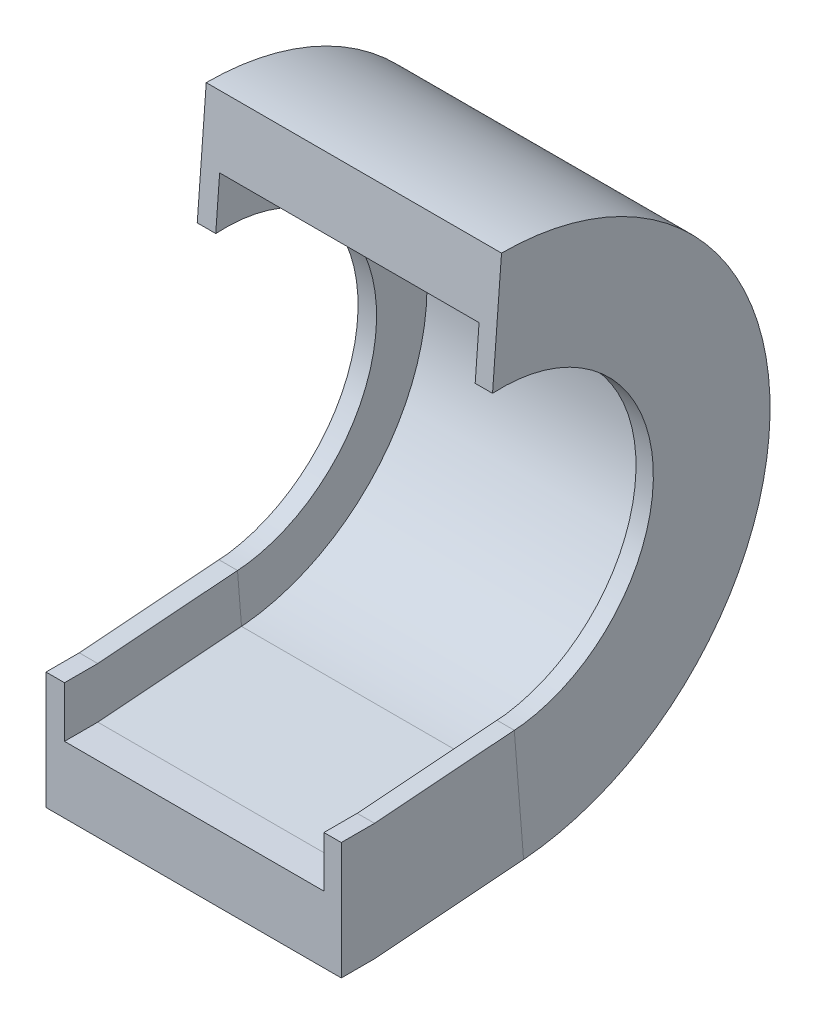
ISO-10303-21;
HEADER;
FILE_DESCRIPTION(('STEP AP214'),'2;1');
FILE_NAME('part.step','',(''),(''),'','','');
FILE_SCHEMA(('AUTOMOTIVE_DESIGN { 1 0 10303 214 1 1 1 1 }'));
ENDSEC;
DATA;
#1=APPLICATION_CONTEXT('core data for automotive mechanical design processes');
#2=APPLICATION_PROTOCOL_DEFINITION('international standard','automotive_design',2000,#1);
#3=PRODUCT_CONTEXT('',#1,'mechanical');
#4=PRODUCT('Part','Part','',(#3));
#5=PRODUCT_RELATED_PRODUCT_CATEGORY('part','',(#4));
#6=PRODUCT_DEFINITION_FORMATION('','',#4);
#7=PRODUCT_DEFINITION_CONTEXT('part definition',#1,'design');
#8=PRODUCT_DEFINITION('design','',#6,#7);
#9=PRODUCT_DEFINITION_SHAPE('','',#8);
#10=(LENGTH_UNIT() NAMED_UNIT(*) SI_UNIT(.MILLI.,.METRE.));
#11=(NAMED_UNIT(*) PLANE_ANGLE_UNIT() SI_UNIT($,.RADIAN.));
#12=(NAMED_UNIT(*) SI_UNIT($,.STERADIAN.) SOLID_ANGLE_UNIT());
#13=UNCERTAINTY_MEASURE_WITH_UNIT(LENGTH_MEASURE(1.E-05),#10,'distance_accuracy_value','');
#14=(GEOMETRIC_REPRESENTATION_CONTEXT(3) GLOBAL_UNCERTAINTY_ASSIGNED_CONTEXT((#13)) GLOBAL_UNIT_ASSIGNED_CONTEXT((#10,
#11,#12)) REPRESENTATION_CONTEXT('',''));
#15=CARTESIAN_POINT('',(0.,0.,0.));
#16=DIRECTION('',(0.,0.,1.));
#17=DIRECTION('',(1.,0.,0.));
#18=AXIS2_PLACEMENT_3D('',#15,#16,#17);
#19=CARTESIAN_POINT('',(0.,10.16,5.08));
#20=DIRECTION('',(0.,1.,0.));
#21=DIRECTION('',(0.,0.,1.));
#22=AXIS2_PLACEMENT_3D('',#19,#20,#21);
#23=PLANE('',#22);
#24=DIRECTION('',(1.,0.,0.));
#25=VECTOR('',#24,1.);
#26=CARTESIAN_POINT('',(0.,10.16,0.));
#27=LINE('',#26,#25);
#28=CARTESIAN_POINT('',(2.82486817631496,10.16,0.));
#29=VERTEX_POINT('',#28);
#30=CARTESIAN_POINT('',(42.4300988688077,10.16,0.));
#31=VERTEX_POINT('',#30);
#32=EDGE_CURVE('E135',#29,#31,#27,.T.);
#33=ORIENTED_EDGE('',*,*,#32,.F.);
#34=DIRECTION('',(0.,0.,-1.));
#35=VECTOR('',#34,1.);
#36=CARTESIAN_POINT('',(2.82486817631496,10.16,5.08));
#37=LINE('',#36,#35);
#38=CARTESIAN_POINT('',(2.82486817631496,10.16,5.08));
#39=VERTEX_POINT('',#38);
#40=EDGE_CURVE('E11',#39,#29,#37,.T.);
#41=ORIENTED_EDGE('',*,*,#40,.F.);
#42=DIRECTION('',(1.,0.,0.));
#43=VECTOR('',#42,1.);
#44=CARTESIAN_POINT('',(0.,10.16,5.08));
#45=LINE('',#44,#43);
#46=CARTESIAN_POINT('',(42.4300988688077,10.16,5.08));
#47=VERTEX_POINT('',#46);
#48=EDGE_CURVE('E145',#39,#47,#45,.T.);
#49=ORIENTED_EDGE('',*,*,#48,.T.);
#50=DIRECTION('',(0.,0.,-1.));
#51=VECTOR('',#50,1.);
#52=CARTESIAN_POINT('',(42.4300988688077,10.16,5.08));
#53=LINE('',#52,#51);
#54=EDGE_CURVE('E53',#47,#31,#53,.T.);
#55=ORIENTED_EDGE('',*,*,#54,.T.);
#56=EDGE_LOOP('',(#33,#41,#49,#55));
#57=FACE_BOUND('',#56,.T.);
#58=ADVANCED_FACE('F37',(#57),#23,.T.);
#59=CARTESIAN_POINT('',(2.82486817631496,0.,5.08));
#60=DIRECTION('',(-1.,0.,0.));
#61=DIRECTION('',(0.,0.,1.));
#62=AXIS2_PLACEMENT_3D('',#59,#60,#61);
#63=PLANE('',#62);
#64=ORIENTED_EDGE('',*,*,#40,.T.);
#65=DIRECTION('',(0.,0.07663842930355,-0.997058950691425));
#66=VECTOR('',#65,1.);
#67=CARTESIAN_POINT('',(2.82486817631496,10.16,0.));
#68=LINE('',#67,#66);
#69=CARTESIAN_POINT('',(2.82486817631496,11.8466468853602,-21.9431216034371));
#70=VERTEX_POINT('',#69);
#71=EDGE_CURVE('E177',#29,#70,#68,.T.);
#72=ORIENTED_EDGE('',*,*,#71,.T.);
#73=DIRECTION('',(0.,0.996845380458141,0.0793680506202854));
#74=VECTOR('',#73,1.);
#75=CARTESIAN_POINT('',(2.82486817631496,19.610093611212,-21.3250020386536));
#76=LINE('',#75,#74);
#77=CARTESIAN_POINT('',(2.82486817631496,19.5517063673251,-21.3296507854093));
#78=VERTEX_POINT('',#77);
#79=EDGE_CURVE('E176',#70,#78,#76,.T.);
#80=ORIENTED_EDGE('',*,*,#79,.T.);
#81=DIRECTION('',(0.,0.07663842930355,-0.997058950691425));
#82=VECTOR('',#81,1.);
#83=CARTESIAN_POINT('',(2.82486817631496,17.9122136044815,0.));
#84=LINE('',#83,#82);
#85=CARTESIAN_POINT('',(2.82486817631496,17.9122136044815,0.));
#86=VERTEX_POINT('',#85);
#87=EDGE_CURVE('E138',#86,#78,#84,.T.);
#88=ORIENTED_EDGE('',*,*,#87,.F.);
#89=DIRECTION('',(0.,0.,-1.));
#90=VECTOR('',#89,1.);
#91=CARTESIAN_POINT('',(2.82486817631496,17.9122136044815,5.08));
#92=LINE('',#91,#90);
#93=CARTESIAN_POINT('',(2.82486817631496,17.9122136044815,5.08));
#94=VERTEX_POINT('',#93);
#95=EDGE_CURVE('E45',#94,#86,#92,.T.);
#96=ORIENTED_EDGE('',*,*,#95,.F.);
#97=DIRECTION('',(0.,1.,0.));
#98=VECTOR('',#97,1.);
#99=CARTESIAN_POINT('',(2.82486817631496,0.,5.08));
#100=LINE('',#99,#98);
#101=EDGE_CURVE('E821',#39,#94,#100,.T.);
#102=ORIENTED_EDGE('',*,*,#101,.F.);
#103=EDGE_LOOP('',(#64,#72,#80,#88,#96,#102));
#104=FACE_BOUND('',#103,.T.);
#105=ADVANCED_FACE('F173',(#104),#63,.F.);
#106=CARTESIAN_POINT('',(0.,17.9122136044815,5.08));
#107=DIRECTION('',(0.,1.,0.));
#108=DIRECTION('',(0.,0.,1.));
#109=AXIS2_PLACEMENT_3D('',#106,#107,#108);
#110=PLANE('',#109);
#111=DIRECTION('',(1.,0.,0.));
#112=VECTOR('',#111,1.);
#113=CARTESIAN_POINT('',(0.,17.9122136044815,0.));
#114=LINE('',#113,#112);
#115=CARTESIAN_POINT('',(0.,17.9122136044815,0.));
#116=VERTEX_POINT('',#115);
#117=EDGE_CURVE('E137',#116,#86,#114,.T.);
#118=ORIENTED_EDGE('',*,*,#117,.F.);
#119=DIRECTION('',(0.,0.,-1.));
#120=VECTOR('',#119,1.);
#121=CARTESIAN_POINT('',(0.,17.9122136044815,5.08));
#122=LINE('',#121,#120);
#123=CARTESIAN_POINT('',(0.,17.9122136044815,5.08));
#124=VERTEX_POINT('',#123);
#125=EDGE_CURVE('E151',#124,#116,#122,.T.);
#126=ORIENTED_EDGE('',*,*,#125,.F.);
#127=DIRECTION('',(1.,0.,0.));
#128=VECTOR('',#127,1.);
#129=CARTESIAN_POINT('',(0.,17.9122136044815,5.08));
#130=LINE('',#129,#128);
#131=EDGE_CURVE('E160',#124,#94,#130,.T.);
#132=ORIENTED_EDGE('',*,*,#131,.T.);
#133=ORIENTED_EDGE('',*,*,#95,.T.);
#134=EDGE_LOOP('',(#118,#126,#132,#133));
#135=FACE_BOUND('',#134,.T.);
#136=ADVANCED_FACE('F157',(#135),#110,.T.);
#137=CARTESIAN_POINT('',(0.,0.,5.08));
#138=DIRECTION('',(-1.,0.,0.));
#139=DIRECTION('',(0.,0.,1.));
#140=AXIS2_PLACEMENT_3D('',#137,#138,#139);
#141=PLANE('',#140);
#142=ORIENTED_EDGE('',*,*,#125,.T.);
#143=DIRECTION('',(0.,0.07663842930355,-0.997058950691425));
#144=VECTOR('',#143,1.);
#145=CARTESIAN_POINT('',(0.,17.9122136044815,0.));
#146=LINE('',#145,#144);
#147=CARTESIAN_POINT('',(0.,19.5517063673251,-21.3296507854093));
#148=VERTEX_POINT('',#147);
#149=EDGE_CURVE('E171',#116,#148,#146,.T.);
#150=ORIENTED_EDGE('',*,*,#149,.T.);
#151=DIRECTION('',(0.,-0.996845380458141,-0.0793680506202854));
#152=VECTOR('',#151,1.);
#153=CARTESIAN_POINT('',(0.,1.81071418925688,-22.7421747262796));
#154=LINE('',#153,#152);
#155=CARTESIAN_POINT('',(0.,1.74844676720198,-22.7471324097905));
#156=VERTEX_POINT('',#155);
#157=EDGE_CURVE('E218',#148,#156,#154,.T.);
#158=ORIENTED_EDGE('',*,*,#157,.T.);
#159=DIRECTION('',(0.,0.07663842930355,-0.997058950691425));
#160=VECTOR('',#159,1.);
#161=CARTESIAN_POINT('',(0.,0.,0.));
#162=LINE('',#161,#160);
#163=CARTESIAN_POINT('',(0.,0.,0.));
#164=VERTEX_POINT('',#163);
#165=EDGE_CURVE('E228',#164,#156,#162,.T.);
#166=ORIENTED_EDGE('',*,*,#165,.F.);
#167=DIRECTION('',(0.,0.,-1.));
#168=VECTOR('',#167,1.);
#169=CARTESIAN_POINT('',(0.,0.,5.08));
#170=LINE('',#169,#168);
#171=CARTESIAN_POINT('',(0.,0.,5.08));
#172=VERTEX_POINT('',#171);
#173=EDGE_CURVE('E149',#172,#164,#170,.T.);
#174=ORIENTED_EDGE('',*,*,#173,.F.);
#175=DIRECTION('',(0.,1.,0.));
#176=VECTOR('',#175,1.);
#177=CARTESIAN_POINT('',(0.,0.,5.08));
#178=LINE('',#177,#176);
#179=EDGE_CURVE('E819',#172,#124,#178,.T.);
#180=ORIENTED_EDGE('',*,*,#179,.T.);
#181=EDGE_LOOP('',(#142,#150,#158,#166,#174,#180));
#182=FACE_BOUND('',#181,.T.);
#183=ADVANCED_FACE('F485',(#182),#141,.T.);
#184=CARTESIAN_POINT('',(0.,0.,5.08));
#185=DIRECTION('',(0.,1.,0.));
#186=DIRECTION('',(0.,0.,1.));
#187=AXIS2_PLACEMENT_3D('',#184,#185,#186);
#188=PLANE('',#187);
#189=DIRECTION('',(1.,0.,0.));
#190=VECTOR('',#189,1.);
#191=CARTESIAN_POINT('',(0.,0.,0.));
#192=LINE('',#191,#190);
#193=CARTESIAN_POINT('',(45.08000001,0.,0.));
#194=VERTEX_POINT('',#193);
#195=EDGE_CURVE('E141',#164,#194,#192,.T.);
#196=ORIENTED_EDGE('',*,*,#195,.T.);
#197=DIRECTION('',(0.,0.,-1.));
#198=VECTOR('',#197,1.);
#199=CARTESIAN_POINT('',(45.08000001,0.,5.08));
#200=LINE('',#199,#198);
#201=CARTESIAN_POINT('',(45.08000001,0.,5.08));
#202=VERTEX_POINT('',#201);
#203=EDGE_CURVE('E127',#202,#194,#200,.T.);
#204=ORIENTED_EDGE('',*,*,#203,.F.);
#205=DIRECTION('',(1.,0.,0.));
#206=VECTOR('',#205,1.);
#207=CARTESIAN_POINT('',(0.,0.,5.08));
#208=LINE('',#207,#206);
#209=EDGE_CURVE('E114',#172,#202,#208,.T.);
#210=ORIENTED_EDGE('',*,*,#209,.F.);
#211=ORIENTED_EDGE('',*,*,#173,.T.);
#212=EDGE_LOOP('',(#196,#204,#210,#211));
#213=FACE_BOUND('',#212,.T.);
#214=ADVANCED_FACE('F482',(#213),#188,.F.);
#215=CARTESIAN_POINT('',(45.08000001,0.,5.08));
#216=DIRECTION('',(-1.,0.,0.));
#217=DIRECTION('',(0.,0.,1.));
#218=AXIS2_PLACEMENT_3D('',#215,#216,#217);
#219=PLANE('',#218);
#220=ORIENTED_EDGE('',*,*,#203,.T.);
#221=DIRECTION('',(0.,0.07663842930355,-0.997058950691425));
#222=VECTOR('',#221,1.);
#223=CARTESIAN_POINT('',(45.08000001,0.,0.));
#224=LINE('',#223,#222);
#225=CARTESIAN_POINT('',(45.08000001,1.74844676720198,-22.7471324097905));
#226=VERTEX_POINT('',#225);
#227=EDGE_CURVE('E266',#194,#226,#224,.T.);
#228=ORIENTED_EDGE('',*,*,#227,.T.);
#229=DIRECTION('',(0.,0.996845380458141,0.0793680506202854));
#230=VECTOR('',#229,1.);
#231=CARTESIAN_POINT('',(45.08000001,19.610093611212,-21.3250020386536));
#232=LINE('',#231,#230);
#233=CARTESIAN_POINT('',(45.08000001,19.5517063673251,-21.3296507854093));
#234=VERTEX_POINT('',#233);
#235=EDGE_CURVE('E286',#226,#234,#232,.T.);
#236=ORIENTED_EDGE('',*,*,#235,.T.);
#237=DIRECTION('',(0.,0.07663842930355,-0.997058950691425));
#238=VECTOR('',#237,1.);
#239=CARTESIAN_POINT('',(45.08000001,17.9122136044815,0.));
#240=LINE('',#239,#238);
#241=CARTESIAN_POINT('',(45.08000001,17.9122136044815,0.));
#242=VERTEX_POINT('',#241);
#243=EDGE_CURVE('E124',#242,#234,#240,.T.);
#244=ORIENTED_EDGE('',*,*,#243,.F.);
#245=DIRECTION('',(0.,0.,-1.));
#246=VECTOR('',#245,1.);
#247=CARTESIAN_POINT('',(45.08000001,17.9122136044815,5.08));
#248=LINE('',#247,#246);
#249=CARTESIAN_POINT('',(45.08000001,17.9122136044815,5.08));
#250=VERTEX_POINT('',#249);
#251=EDGE_CURVE('E120',#250,#242,#248,.T.);
#252=ORIENTED_EDGE('',*,*,#251,.F.);
#253=DIRECTION('',(0.,1.,0.));
#254=VECTOR('',#253,1.);
#255=CARTESIAN_POINT('',(45.08000001,0.,5.08));
#256=LINE('',#255,#254);
#257=EDGE_CURVE('E105',#202,#250,#256,.T.);
#258=ORIENTED_EDGE('',*,*,#257,.F.);
#259=EDGE_LOOP('',(#220,#228,#236,#244,#252,#258));
#260=FACE_BOUND('',#259,.T.);
#261=ADVANCED_FACE('F121',(#260),#219,.F.);
#262=CARTESIAN_POINT('',(0.,17.9122136044815,5.08));
#263=DIRECTION('',(0.,-1.,0.));
#264=DIRECTION('',(0.,0.,-1.));
#265=AXIS2_PLACEMENT_3D('',#262,#263,#264);
#266=PLANE('',#265);
#267=DIRECTION('',(-1.,0.,0.));
#268=VECTOR('',#267,1.);
#269=CARTESIAN_POINT('',(0.,17.9122136044815,0.));
#270=LINE('',#269,#268);
#271=CARTESIAN_POINT('',(42.4300988688077,17.9122136044815,0.));
#272=VERTEX_POINT('',#271);
#273=EDGE_CURVE('E143',#242,#272,#270,.T.);
#274=ORIENTED_EDGE('',*,*,#273,.T.);
#275=DIRECTION('',(0.,0.,-1.));
#276=VECTOR('',#275,1.);
#277=CARTESIAN_POINT('',(42.4300988688077,17.9122136044815,5.08));
#278=LINE('',#277,#276);
#279=CARTESIAN_POINT('',(42.4300988688077,17.9122136044815,5.08));
#280=VERTEX_POINT('',#279);
#281=EDGE_CURVE('E78',#280,#272,#278,.T.);
#282=ORIENTED_EDGE('',*,*,#281,.F.);
#283=DIRECTION('',(-1.,0.,0.));
#284=VECTOR('',#283,1.);
#285=CARTESIAN_POINT('',(0.,17.9122136044815,5.08));
#286=LINE('',#285,#284);
#287=EDGE_CURVE('E111',#250,#280,#286,.T.);
#288=ORIENTED_EDGE('',*,*,#287,.F.);
#289=ORIENTED_EDGE('',*,*,#251,.T.);
#290=EDGE_LOOP('',(#274,#282,#288,#289));
#291=FACE_BOUND('',#290,.T.);
#292=ADVANCED_FACE('F129',(#291),#266,.F.);
#293=CARTESIAN_POINT('',(42.4300988688077,0.,5.08));
#294=DIRECTION('',(-1.,0.,0.));
#295=DIRECTION('',(0.,0.,1.));
#296=AXIS2_PLACEMENT_3D('',#293,#294,#295);
#297=PLANE('',#296);
#298=ORIENTED_EDGE('',*,*,#281,.T.);
#299=DIRECTION('',(0.,0.07663842930355,-0.997058950691425));
#300=VECTOR('',#299,1.);
#301=CARTESIAN_POINT('',(42.4300988688077,17.9122136044815,0.));
#302=LINE('',#301,#300);
#303=CARTESIAN_POINT('',(42.4300988688077,19.5517063673251,-21.3296507854093));
#304=VERTEX_POINT('',#303);
#305=EDGE_CURVE('E196',#272,#304,#302,.T.);
#306=ORIENTED_EDGE('',*,*,#305,.T.);
#307=DIRECTION('',(0.,-0.996845380458141,-0.0793680506202854));
#308=VECTOR('',#307,1.);
#309=CARTESIAN_POINT('',(42.4300988688077,11.9067134286708,-21.9383391521729));
#310=LINE('',#309,#308);
#311=CARTESIAN_POINT('',(42.4300988688077,11.8466468853602,-21.9431216034371));
#312=VERTEX_POINT('',#311);
#313=EDGE_CURVE('E187',#304,#312,#310,.T.);
#314=ORIENTED_EDGE('',*,*,#313,.T.);
#315=DIRECTION('',(0.,0.07663842930355,-0.997058950691425));
#316=VECTOR('',#315,1.);
#317=CARTESIAN_POINT('',(42.4300988688077,10.16,0.));
#318=LINE('',#317,#316);
#319=EDGE_CURVE('E179',#31,#312,#318,.T.);
#320=ORIENTED_EDGE('',*,*,#319,.F.);
#321=ORIENTED_EDGE('',*,*,#54,.F.);
#322=DIRECTION('',(0.,1.,0.));
#323=VECTOR('',#322,1.);
#324=CARTESIAN_POINT('',(42.4300988688077,0.,5.08));
#325=LINE('',#324,#323);
#326=EDGE_CURVE('E130',#47,#280,#325,.T.);
#327=ORIENTED_EDGE('',*,*,#326,.T.);
#328=EDGE_LOOP('',(#298,#306,#314,#320,#321,#327));
#329=FACE_BOUND('',#328,.T.);
#330=ADVANCED_FACE('F304',(#329),#297,.T.);
#331=CARTESIAN_POINT('',(0.,0.,5.08));
#332=DIRECTION('',(0.,0.,1.));
#333=DIRECTION('',(1.,0.,0.));
#334=AXIS2_PLACEMENT_3D('',#331,#332,#333);
#335=PLANE('',#334);
#336=ORIENTED_EDGE('',*,*,#48,.F.);
#337=ORIENTED_EDGE('',*,*,#101,.T.);
#338=ORIENTED_EDGE('',*,*,#131,.F.);
#339=ORIENTED_EDGE('',*,*,#179,.F.);
#340=ORIENTED_EDGE('',*,*,#209,.T.);
#341=ORIENTED_EDGE('',*,*,#257,.T.);
#342=ORIENTED_EDGE('',*,*,#287,.T.);
#343=ORIENTED_EDGE('',*,*,#326,.F.);
#344=EDGE_LOOP('',(#336,#337,#338,#339,#340,#341,#342,#343));
#345=FACE_BOUND('',#344,.T.);
#346=ADVANCED_FACE('F108',(#345),#335,.T.);
#347=CARTESIAN_POINT('',(0.,83.6100446017709,-19.3811522544792));
#348=DIRECTION('',(0.,-0.0766384293035501,-0.997058950691425));
#349=DIRECTION('',(1.,0.,0.));
#350=AXIS2_PLACEMENT_3D('',#347,#348,#349);
#351=PLANE('',#350);
#352=DIRECTION('',(0.,0.997058950691425,-0.0766384293035501));
#353=VECTOR('',#352,1.);
#354=CARTESIAN_POINT('',(2.82486817631496,65.750511700726,-18.0083883384821));
#355=LINE('',#354,#353);
#356=CARTESIAN_POINT('',(2.82486817631496,65.750511700726,-18.0083883384821));
#357=VERTEX_POINT('',#356);
#358=CARTESIAN_POINT('',(2.82486817631496,73.4799256627461,-18.6025058127552));
#359=VERTEX_POINT('',#358);
#360=EDGE_CURVE('E386',#357,#359,#355,.T.);
#361=ORIENTED_EDGE('',*,*,#360,.T.);
#362=DIRECTION('',(1.,0.,0.));
#363=VECTOR('',#362,1.);
#364=CARTESIAN_POINT('',(2.82486817631496,73.4799256627461,-18.6025058127552));
#365=LINE('',#364,#363);
#366=CARTESIAN_POINT('',(42.4300988688077,73.4799256627461,-18.6025058127552));
#367=VERTEX_POINT('',#366);
#368=EDGE_CURVE('E558',#359,#367,#365,.T.);
#369=ORIENTED_EDGE('',*,*,#368,.T.);
#370=DIRECTION('',(0.,-0.997058950691425,0.0766384293035501));
#371=VECTOR('',#370,1.);
#372=CARTESIAN_POINT('',(42.4300988688077,73.4799256627461,-18.6025058127552));
#373=LINE('',#372,#371);
#374=CARTESIAN_POINT('',(42.4300988688077,65.750511700726,-18.0083883384821));
#375=VERTEX_POINT('',#374);
#376=EDGE_CURVE('E557',#367,#375,#373,.T.);
#377=ORIENTED_EDGE('',*,*,#376,.T.);
#378=DIRECTION('',(1.,0.,0.));
#379=VECTOR('',#378,1.);
#380=CARTESIAN_POINT('',(42.4300988688077,65.750511700726,-18.0083883384821));
#381=LINE('',#380,#379);
#382=CARTESIAN_POINT('',(45.08000001,65.750511700726,-18.0083883384821));
#383=VERTEX_POINT('',#382);
#384=EDGE_CURVE('E380',#375,#383,#381,.T.);
#385=ORIENTED_EDGE('',*,*,#384,.T.);
#386=DIRECTION('',(0.,0.997058950691425,-0.0766384293035501));
#387=VECTOR('',#386,1.);
#388=CARTESIAN_POINT('',(45.08000001,65.750511700726,-18.0083883384821));
#389=LINE('',#388,#387);
#390=CARTESIAN_POINT('',(45.08000001,83.610044601771,-19.3811522544792));
#391=VERTEX_POINT('',#390);
#392=EDGE_CURVE('E261',#383,#391,#389,.T.);
#393=ORIENTED_EDGE('',*,*,#392,.T.);
#394=DIRECTION('',(-1.,0.,0.));
#395=VECTOR('',#394,1.);
#396=CARTESIAN_POINT('',(45.08000001,83.6100446017709,-19.3811522544792));
#397=LINE('',#396,#395);
#398=CARTESIAN_POINT('',(0.,83.610044601771,-19.3811522544792));
#399=VERTEX_POINT('',#398);
#400=EDGE_CURVE('E224',#391,#399,#397,.T.);
#401=ORIENTED_EDGE('',*,*,#400,.T.);
#402=DIRECTION('',(0.,-0.997058950691425,0.0766384293035501));
#403=VECTOR('',#402,1.);
#404=CARTESIAN_POINT('',(0.,83.6100446017709,-19.3811522544792));
#405=LINE('',#404,#403);
#406=CARTESIAN_POINT('',(0.,65.750511700726,-18.0083883384821));
#407=VERTEX_POINT('',#406);
#408=EDGE_CURVE('E225',#399,#407,#405,.T.);
#409=ORIENTED_EDGE('',*,*,#408,.T.);
#410=DIRECTION('',(1.,0.,0.));
#411=VECTOR('',#410,1.);
#412=CARTESIAN_POINT('',(0.,65.750511700726,-18.0083883384821));
#413=LINE('',#412,#411);
#414=EDGE_CURVE('E533',#407,#357,#413,.T.);
#415=ORIENTED_EDGE('',*,*,#414,.T.);
#416=EDGE_LOOP('',(#361,#369,#377,#385,#393,#401,#409,#415));
#417=FACE_BOUND('',#416,.T.);
#418=ADVANCED_FACE('F411',(#417),#351,.F.);
#419=CARTESIAN_POINT('',(2.82486817631496,19.532628114727,-21.0980487411083));
#420=DIRECTION('',(1.,0.,0.));
#421=DIRECTION('',(0.,0.,-1.));
#422=AXIS2_PLACEMENT_3D('',#419,#420,#421);
#423=PLANE('',#422);
#424=ORIENTED_EDGE('',*,*,#79,.F.);
#425=DIRECTION('',(0.,0.0820970769588123,-0.996624337428511));
#426=VECTOR('',#425,1.);
#427=CARTESIAN_POINT('',(2.82486817631496,11.7805307381101,-21.1404990998427));
#428=LINE('',#427,#426);
#429=CARTESIAN_POINT('',(2.82486817631496,11.9082944397296,-22.6914972497258));
#430=VERTEX_POINT('',#429);
#431=EDGE_CURVE('E199',#70,#430,#428,.T.);
#432=ORIENTED_EDGE('',*,*,#431,.T.);
#433=CARTESIAN_POINT('',(2.82486817631496,42.6100446017709,-19.3811522544792));
#434=DIRECTION('',(1.,0.,0.));
#435=DIRECTION('',(0.,-0.994237332809413,-0.107201334170915));
#436=AXIS2_PLACEMENT_3D('',#433,#434,#435);
#437=CIRCLE('',#436,30.8796995937454);
#438=EDGE_CURVE('E240',#430,#359,#437,.T.);
#439=ORIENTED_EDGE('',*,*,#438,.T.);
#440=ORIENTED_EDGE('',*,*,#360,.F.);
#441=CARTESIAN_POINT('',(2.82486817631496,42.6100446017709,-19.3811522544792));
#442=DIRECTION('',(1.,0.,0.));
#443=DIRECTION('',(0.,-0.990013573457151,-0.140972069469811));
#444=AXIS2_PLACEMENT_3D('',#441,#442,#443);
#445=CIRCLE('',#444,23.1811496334173);
#446=CARTESIAN_POINT('',(2.82486817631496,19.6603918163465,-22.6490468909914));
#447=VERTEX_POINT('',#446);
#448=EDGE_CURVE('E239',#447,#357,#445,.T.);
#449=ORIENTED_EDGE('',*,*,#448,.F.);
#450=DIRECTION('',(0.,0.0820970769588123,-0.996624337428511));
#451=VECTOR('',#450,1.);
#452=CARTESIAN_POINT('',(2.82486817631496,19.532628114727,-21.0980487411083));
#453=LINE('',#452,#451);
#454=EDGE_CURVE('E203',#78,#447,#453,.T.);
#455=ORIENTED_EDGE('',*,*,#454,.F.);
#456=EDGE_LOOP('',(#424,#432,#439,#440,#449,#455));
#457=FACE_BOUND('',#456,.T.);
#458=ADVANCED_FACE('F400',(#457),#423,.T.);
#459=CARTESIAN_POINT('',(2.82486817631496,11.7805307381101,-21.1404990998427));
#460=CARTESIAN_POINT('',(2.82486817631496,11.8018246883804,-21.3989987914898));
#461=CARTESIAN_POINT('',(2.82486817631496,11.8231186386497,-21.657498483137));
#462=CARTESIAN_POINT('',(2.82486817631496,11.8550595640549,-22.0452480206078));
#463=CARTESIAN_POINT('',(2.82486817631496,11.8657065391898,-22.1744978664314));
#464=CARTESIAN_POINT('',(2.82486817631496,11.8816770018922,-22.3683726351668));
#465=CARTESIAN_POINT('',(2.82486817631496,11.8870004894597,-22.4329975580786));
#466=CARTESIAN_POINT('',(2.82486817631496,11.8976474645946,-22.5622474039022));
#467=CARTESIAN_POINT('',(2.82486817631496,11.9030146512715,-22.6349065460117));
#468=CARTESIAN_POINT('',(2.82486817631496,11.9149448396606,-22.7627786684917));
#469=CARTESIAN_POINT('',(2.82486817631496,11.9216663546799,-22.8138001603371));
#470=CARTESIAN_POINT('',(2.82486817631496,11.9355860986247,-22.9360399630972));
#471=CARTESIAN_POINT('',(2.82486817631496,11.9427285387539,-22.9971384874832));
#472=CARTESIAN_POINT('',(2.82486817631496,11.964703173485,-23.1803668481776));
#473=CARTESIAN_POINT('',(2.82486817631496,11.9800826881784,-23.3024294757026));
#474=CARTESIAN_POINT('',(2.82486817631496,12.0284071831227,-23.6683237334006));
#475=CARTESIAN_POINT('',(2.82486817631496,12.0635382111715,-23.9118617869677));
#476=CARTESIAN_POINT('',(2.82486817631496,12.177645414812,-24.6411013873615));
#477=CARTESIAN_POINT('',(2.82486817631496,12.265337382363,-25.1254288316138));
#478=CARTESIAN_POINT('',(2.82486817631496,12.562977216366,-26.5712898777377));
#479=CARTESIAN_POINT('',(2.82486817631496,12.8075168717784,-27.5256991232559));
#480=CARTESIAN_POINT('',(2.82486817631496,13.6761121609344,-30.3473377211058));
#481=CARTESIAN_POINT('',(2.82486817631496,14.4354515467681,-32.172631908368));
#482=CARTESIAN_POINT('',(2.82486817631496,17.2134351426277,-37.382909646097));
#483=CARTESIAN_POINT('',(2.82486817631496,19.7369263917118,-40.496821902952));
#484=CARTESIAN_POINT('',(2.82486817631496,25.7657755277539,-45.5598008200006));
#485=CARTESIAN_POINT('',(2.82486817631496,29.2689995792362,-47.5070755115419));
#486=CARTESIAN_POINT('',(2.82486817631496,36.751699078103,-49.9545202252859));
#487=CARTESIAN_POINT('',(2.82486817631496,40.7285261070451,-50.4538240016769));
#488=CARTESIAN_POINT('',(2.82486817631496,48.5840096716882,-49.932138862081));
#489=CARTESIAN_POINT('',(2.82486817631496,52.4598858459564,-48.9113345908254));
#490=CARTESIAN_POINT('',(2.82486817631496,59.5532290373943,-45.4958902875696));
#491=CARTESIAN_POINT('',(2.82486817631496,62.7681854440901,-43.1024591142651));
#492=CARTESIAN_POINT('',(2.82486817631496,68.0745743885201,-37.2867034633897));
#493=CARTESIAN_POINT('',(2.82486817631496,70.1641287951083,-33.8664373905146));
#494=CARTESIAN_POINT('',(2.82486817631496,72.9169206054321,-26.4906042801042));
#495=CARTESIAN_POINT('',(2.82486817631496,73.5792140385117,-22.5388499389671));
#496=CARTESIAN_POINT('',(2.82486817631496,73.4799256627461,-18.6025058127552));
#497=CARTESIAN_POINT('',(42.4300988688077,11.7805307381101,-21.1404990998427));
#498=CARTESIAN_POINT('',(42.4300988688077,11.8018246883804,-21.3989987914898));
#499=CARTESIAN_POINT('',(42.4300988688077,11.8231186386497,-21.657498483137));
#500=CARTESIAN_POINT('',(42.4300988688077,11.8550595640549,-22.0452480206078));
#501=CARTESIAN_POINT('',(42.4300988688077,11.8657065391898,-22.1744978664314));
#502=CARTESIAN_POINT('',(42.4300988688077,11.8816770018922,-22.3683726351668));
#503=CARTESIAN_POINT('',(42.4300988688077,11.8870004894597,-22.4329975580786));
#504=CARTESIAN_POINT('',(42.4300988688077,11.8976474645946,-22.5622474039022));
#505=CARTESIAN_POINT('',(42.4300988688077,11.9030146512715,-22.6349065460117));
#506=CARTESIAN_POINT('',(42.4300988688077,11.9149448396606,-22.7627786684917));
#507=CARTESIAN_POINT('',(42.4300988688077,11.9216663546799,-22.8138001603371));
#508=CARTESIAN_POINT('',(42.4300988688077,11.9355860986247,-22.9360399630972));
#509=CARTESIAN_POINT('',(42.4300988688077,11.9427285387539,-22.9971384874832));
#510=CARTESIAN_POINT('',(42.4300988688077,11.964703173485,-23.1803668481776));
#511=CARTESIAN_POINT('',(42.4300988688077,11.9800826881784,-23.3024294757026));
#512=CARTESIAN_POINT('',(42.4300988688077,12.0284071831227,-23.6683237334006));
#513=CARTESIAN_POINT('',(42.4300988688077,12.0635382111715,-23.9118617869677));
#514=CARTESIAN_POINT('',(42.4300988688077,12.177645414812,-24.6411013873615));
#515=CARTESIAN_POINT('',(42.4300988688077,12.265337382363,-25.1254288316138));
#516=CARTESIAN_POINT('',(42.4300988688077,12.562977216366,-26.5712898777377));
#517=CARTESIAN_POINT('',(42.4300988688077,12.8075168717784,-27.5256991232559));
#518=CARTESIAN_POINT('',(42.4300988688077,13.6761121609344,-30.3473377211058));
#519=CARTESIAN_POINT('',(42.4300988688077,14.4354515467681,-32.172631908368));
#520=CARTESIAN_POINT('',(42.4300988688077,17.2134351426277,-37.382909646097));
#521=CARTESIAN_POINT('',(42.4300988688077,19.7369263917118,-40.496821902952));
#522=CARTESIAN_POINT('',(42.4300988688077,25.7657755277539,-45.5598008200006));
#523=CARTESIAN_POINT('',(42.4300988688077,29.2689995792362,-47.5070755115419));
#524=CARTESIAN_POINT('',(42.4300988688077,36.751699078103,-49.9545202252859));
#525=CARTESIAN_POINT('',(42.4300988688077,40.7285261070451,-50.4538240016769));
#526=CARTESIAN_POINT('',(42.4300988688077,48.5840096716882,-49.932138862081));
#527=CARTESIAN_POINT('',(42.4300988688077,52.4598858459564,-48.9113345908254));
#528=CARTESIAN_POINT('',(42.4300988688077,59.5532290373943,-45.4958902875696));
#529=CARTESIAN_POINT('',(42.4300988688077,62.7681854440901,-43.1024591142651));
#530=CARTESIAN_POINT('',(42.4300988688077,68.0745743885201,-37.2867034633897));
#531=CARTESIAN_POINT('',(42.4300988688077,70.1641287951083,-33.8664373905146));
#532=CARTESIAN_POINT('',(42.4300988688077,72.9169206054321,-26.4906042801042));
#533=CARTESIAN_POINT('',(42.4300988688077,73.5792140385117,-22.5388499389671));
#534=CARTESIAN_POINT('',(42.4300988688077,73.4799256627461,-18.6025058127552));
#535=B_SPLINE_SURFACE_WITH_KNOTS('',1,3,((#459,#460,#461,#462,#463,#464,#465,#466,#467,#468,
#469,#470,#471,#472,#473,#474,#475,#476,#477,#478,#479,#480,#481,#482,#483,#484,#485,#486,#487,
#488,#489,#490,#491,#492,#493,#494,#495,#496),(#497,#498,#499,#500,#501,#502,#503,#504,#505,
#506,#507,#508,#509,#510,#511,#512,#513,#514,#515,#516,#517,#518,#519,#520,#521,#522,#523,#524,
#525,#526,#527,#528,#529,#530,#531,#532,#533,#534)),.UNSPECIFIED.,.F.,.F.,.F.,(2,2),(4,2,2,2,2,
2,2,2,2,2,2,2,2,2,2,2,2,2,4),(0.,1.),(-0.012404771970603,-0.00620238598530148,
-0.00310119299265074,-0.00155059649632537,0.,0.001953125,0.00390625,0.0078125,0.015625,0.03125,
0.0625,0.125,0.25,0.375,0.5,0.625,0.75,0.875,1.),.UNSPECIFIED.);
#536=DIRECTION('',(-1.,0.,0.));
#537=VECTOR('',#536,1.);
#538=CARTESIAN_POINT('',(2.82486817631496,11.8466468853602,-21.9431216034371));
#539=LINE('',#538,#537);
#540=EDGE_CURVE('E190',#312,#70,#539,.T.);
#541=DIRECTION('',(0.,0.0820970769588123,-0.996624337428511));
#542=VECTOR('',#541,1.);
#543=CARTESIAN_POINT('',(42.4300988688077,11.7805307381101,-21.1404990998427));
#544=LINE('',#543,#542);
#545=CARTESIAN_POINT('',(42.4300988688077,11.9082944397296,-22.6914972497258));
#546=VERTEX_POINT('',#545);
#547=EDGE_CURVE('E204',#312,#546,#544,.T.);
#548=CARTESIAN_POINT('',(42.4300988688077,42.6100446017709,-19.3811522544792));
#549=DIRECTION('',(1.,0.,0.));
#550=DIRECTION('',(0.,-0.994237332809413,-0.107201334170915));
#551=AXIS2_PLACEMENT_3D('',#548,#549,#550);
#552=CIRCLE('',#551,30.8796995937454);
#553=EDGE_CURVE('E550',#546,#367,#552,.T.);
#554=ORIENTED_EDGE('',*,*,#540,.F.);
#555=ORIENTED_EDGE('',*,*,#547,.T.);
#556=ORIENTED_EDGE('',*,*,#553,.T.);
#557=ORIENTED_EDGE('',*,*,#368,.F.);
#558=ORIENTED_EDGE('',*,*,#438,.F.);
#559=ORIENTED_EDGE('',*,*,#431,.F.);
#560=EDGE_LOOP('',(#554,#555,#556,#557,#558,#559));
#561=FACE_BOUND('',#560,.T.);
#562=ADVANCED_FACE('F410',(#561),#535,.T.);
#563=CARTESIAN_POINT('',(42.4300988688077,11.7805307381101,-21.1404990998427));
#564=DIRECTION('',(-1.,0.,0.));
#565=DIRECTION('',(0.,0.,1.));
#566=AXIS2_PLACEMENT_3D('',#563,#564,#565);
#567=PLANE('',#566);
#568=ORIENTED_EDGE('',*,*,#313,.F.);
#569=DIRECTION('',(0.,0.0820970769588123,-0.996624337428511));
#570=VECTOR('',#569,1.);
#571=CARTESIAN_POINT('',(42.4300988688077,19.532628114727,-21.0980487411083));
#572=LINE('',#571,#570);
#573=CARTESIAN_POINT('',(42.4300988688077,19.6603918163465,-22.6490468909914));
#574=VERTEX_POINT('',#573);
#575=EDGE_CURVE('E256',#304,#574,#572,.T.);
#576=ORIENTED_EDGE('',*,*,#575,.T.);
#577=CARTESIAN_POINT('',(42.4300988688077,42.6100446017709,-19.3811522544792));
#578=DIRECTION('',(1.,0.,0.));
#579=DIRECTION('',(0.,-0.990013573457151,-0.140972069469811));
#580=AXIS2_PLACEMENT_3D('',#577,#578,#579);
#581=CIRCLE('',#580,23.1811496334173);
#582=EDGE_CURVE('E568',#574,#375,#581,.T.);
#583=ORIENTED_EDGE('',*,*,#582,.T.);
#584=ORIENTED_EDGE('',*,*,#376,.F.);
#585=ORIENTED_EDGE('',*,*,#553,.F.);
#586=ORIENTED_EDGE('',*,*,#547,.F.);
#587=EDGE_LOOP('',(#568,#576,#583,#584,#585,#586));
#588=FACE_BOUND('',#587,.T.);
#589=ADVANCED_FACE('F555',(#588),#567,.T.);
#590=CARTESIAN_POINT('',(42.4300988688077,19.532628114727,-21.0980487411083));
#591=CARTESIAN_POINT('',(42.4300988688077,19.5539220649971,-21.3565484327555));
#592=CARTESIAN_POINT('',(42.4300988688077,19.5752160152671,-21.6150481244026));
#593=CARTESIAN_POINT('',(42.4300988688077,19.6071569406716,-22.0027976618735));
#594=CARTESIAN_POINT('',(42.4300988688077,19.6178039158066,-22.132047507697));
#595=CARTESIAN_POINT('',(42.4300988688077,19.6337743785092,-22.3259222764324));
#596=CARTESIAN_POINT('',(42.4300988688077,19.6390978660766,-22.3905471993442));
#597=CARTESIAN_POINT('',(42.4300988688077,19.6497448412116,-22.5197970451678));
#598=CARTESIAN_POINT('',(42.4300988688077,19.6551456714644,-22.5985863763393));
#599=CARTESIAN_POINT('',(42.4300988688077,19.666999838967,-22.7126067487065));
#600=CARTESIAN_POINT('',(42.4300988688077,19.6735484526211,-22.740463970287));
#601=CARTESIAN_POINT('',(42.4300988688077,19.6871144895671,-22.8318197080227));
#602=CARTESIAN_POINT('',(42.4300988688077,19.6940339350767,-22.877476874894));
#603=CARTESIAN_POINT('',(42.4300988688077,19.7152011813028,-23.0143839675782));
#604=CARTESIAN_POINT('',(42.4300988688077,19.7298578961232,-23.105569488077));
#605=CARTESIAN_POINT('',(42.4300988688077,19.7754605657551,-23.3788499146788));
#606=CARTESIAN_POINT('',(42.4300988688077,19.8080391196967,-23.5606687196267));
#607=CARTESIAN_POINT('',(42.4300988688077,19.9122775009913,-24.10487125607));
#608=CARTESIAN_POINT('',(42.4300988688077,19.9904413142863,-24.4660014098655));
#609=CARTESIAN_POINT('',(42.4300988688077,20.2506826856818,-25.5431661289504));
#610=CARTESIAN_POINT('',(42.4300988688077,20.4585309972506,-26.2529719372324));
#611=CARTESIAN_POINT('',(42.4300988688077,21.1822805172189,-28.3477387984635));
#612=CARTESIAN_POINT('',(42.4300988688077,21.7986081225811,-29.6977818255681));
#613=CARTESIAN_POINT('',(42.4300988688077,24.0159087865216,-33.5358671737301));
#614=CARTESIAN_POINT('',(42.4300988688077,25.9887225079482,-35.8076398004415));
#615=CARTESIAN_POINT('',(42.4300988688077,30.6412464323419,-39.4521689607304));
#616=CARTESIAN_POINT('',(42.4300988688077,33.3193099331238,-40.8236355659006));
#617=CARTESIAN_POINT('',(42.4300988688077,38.9957814444379,-42.468701779549));
#618=CARTESIAN_POINT('',(42.4300988688077,41.9921803308973,-42.7417191351501));
#619=CARTESIAN_POINT('',(42.4300988688077,47.872488714054,-42.1496507383299));
#620=CARTESIAN_POINT('',(42.4300988688077,50.7543169406956,-41.2847745419514));
#621=CARTESIAN_POINT('',(42.4300988688077,55.9889020586778,-38.5411108763641));
#622=CARTESIAN_POINT('',(42.4300988688077,58.339806226473,-36.6632944964777));
#623=CARTESIAN_POINT('',(42.4300988688077,62.1723990948856,-32.164427575423));
#624=CARTESIAN_POINT('',(42.4300988688077,63.6527312959723,-29.5449693449938));
#625=CARTESIAN_POINT('',(42.4300988688077,65.5296163673029,-23.9408749702454));
#626=CARTESIAN_POINT('',(42.4300988688077,65.9255584126638,-20.9591234437859));
#627=CARTESIAN_POINT('',(42.4300988688077,65.750511700726,-18.0083883384821));
#628=CARTESIAN_POINT('',(45.08000001,19.532628114727,-21.0980487411083));
#629=CARTESIAN_POINT('',(45.08000001,19.5539220649971,-21.3565484327555));
#630=CARTESIAN_POINT('',(45.08000001,19.5752160152671,-21.6150481244026));
#631=CARTESIAN_POINT('',(45.08000001,19.6071569406716,-22.0027976618735));
#632=CARTESIAN_POINT('',(45.08000001,19.6178039158066,-22.132047507697));
#633=CARTESIAN_POINT('',(45.08000001,19.6337743785092,-22.3259222764324));
#634=CARTESIAN_POINT('',(45.08000001,19.6390978660766,-22.3905471993442));
#635=CARTESIAN_POINT('',(45.08000001,19.6497448412116,-22.5197970451678));
#636=CARTESIAN_POINT('',(45.08000001,19.6551456714644,-22.5985863763393));
#637=CARTESIAN_POINT('',(45.08000001,19.666999838967,-22.7126067487065));
#638=CARTESIAN_POINT('',(45.08000001,19.6735484526211,-22.740463970287));
#639=CARTESIAN_POINT('',(45.08000001,19.6871144895671,-22.8318197080227));
#640=CARTESIAN_POINT('',(45.08000001,19.6940339350767,-22.877476874894));
#641=CARTESIAN_POINT('',(45.08000001,19.7152011813028,-23.0143839675782));
#642=CARTESIAN_POINT('',(45.08000001,19.7298578961232,-23.105569488077));
#643=CARTESIAN_POINT('',(45.08000001,19.7754605657551,-23.3788499146788));
#644=CARTESIAN_POINT('',(45.08000001,19.8080391196967,-23.5606687196267));
#645=CARTESIAN_POINT('',(45.08000001,19.9122775009913,-24.10487125607));
#646=CARTESIAN_POINT('',(45.08000001,19.9904413142863,-24.4660014098655));
#647=CARTESIAN_POINT('',(45.08000001,20.2506826856818,-25.5431661289504));
#648=CARTESIAN_POINT('',(45.08000001,20.4585309972506,-26.2529719372324));
#649=CARTESIAN_POINT('',(45.08000001,21.1822805172189,-28.3477387984635));
#650=CARTESIAN_POINT('',(45.08000001,21.7986081225811,-29.6977818255681));
#651=CARTESIAN_POINT('',(45.08000001,24.0159087865216,-33.5358671737301));
#652=CARTESIAN_POINT('',(45.08000001,25.9887225079482,-35.8076398004415));
#653=CARTESIAN_POINT('',(45.08000001,30.6412464323419,-39.4521689607304));
#654=CARTESIAN_POINT('',(45.08000001,33.3193099331238,-40.8236355659006));
#655=CARTESIAN_POINT('',(45.08000001,38.9957814444379,-42.468701779549));
#656=CARTESIAN_POINT('',(45.08000001,41.9921803308973,-42.7417191351501));
#657=CARTESIAN_POINT('',(45.08000001,47.872488714054,-42.1496507383299));
#658=CARTESIAN_POINT('',(45.08000001,50.7543169406956,-41.2847745419514));
#659=CARTESIAN_POINT('',(45.08000001,55.9889020586778,-38.5411108763641));
#660=CARTESIAN_POINT('',(45.08000001,58.339806226473,-36.6632944964777));
#661=CARTESIAN_POINT('',(45.08000001,62.1723990948856,-32.164427575423));
#662=CARTESIAN_POINT('',(45.08000001,63.6527312959723,-29.5449693449938));
#663=CARTESIAN_POINT('',(45.08000001,65.5296163673029,-23.9408749702454));
#664=CARTESIAN_POINT('',(45.08000001,65.9255584126638,-20.9591234437859));
#665=CARTESIAN_POINT('',(45.08000001,65.750511700726,-18.0083883384821));
#666=B_SPLINE_SURFACE_WITH_KNOTS('',1,3,((#590,#591,#592,#593,#594,#595,#596,#597,#598,#599,
#600,#601,#602,#603,#604,#605,#606,#607,#608,#609,#610,#611,#612,#613,#614,#615,#616,#617,#618,
#619,#620,#621,#622,#623,#624,#625,#626,#627),(#628,#629,#630,#631,#632,#633,#634,#635,#636,
#637,#638,#639,#640,#641,#642,#643,#644,#645,#646,#647,#648,#649,#650,#651,#652,#653,#654,#655,
#656,#657,#658,#659,#660,#661,#662,#663,#664,#665)),.UNSPECIFIED.,.F.,.F.,.F.,(2,2),(4,2,2,2,2,
2,2,2,2,2,2,2,2,2,2,2,2,2,4),(0.,1.),(-0.012404771970603,-0.00620238598530148,
-0.00310119299265074,-0.00155059649632537,0.,0.001953125,0.00390625,0.0078125,0.015625,0.03125,
0.0625,0.125,0.25,0.375,0.5,0.625,0.75,0.875,1.),.UNSPECIFIED.);
#667=DIRECTION('',(-1.,0.,0.));
#668=VECTOR('',#667,1.);
#669=CARTESIAN_POINT('',(42.4300988688077,19.5517063673251,-21.3296507854093));
#670=LINE('',#669,#668);
#671=EDGE_CURVE('E191',#234,#304,#670,.T.);
#672=DIRECTION('',(0.,0.0820970769588123,-0.996624337428511));
#673=VECTOR('',#672,1.);
#674=CARTESIAN_POINT('',(45.08000001,19.532628114727,-21.0980487411083));
#675=LINE('',#674,#673);
#676=CARTESIAN_POINT('',(45.08000001,19.6603918163465,-22.6490468909914));
#677=VERTEX_POINT('',#676);
#678=EDGE_CURVE('E238',#234,#677,#675,.T.);
#679=CARTESIAN_POINT('',(45.08000001,42.6100446017709,-19.3811522544792));
#680=DIRECTION('',(1.,0.,0.));
#681=DIRECTION('',(0.,-0.990013573457151,-0.140972069469811));
#682=AXIS2_PLACEMENT_3D('',#679,#680,#681);
#683=CIRCLE('',#682,23.1811496334173);
#684=EDGE_CURVE('E328',#677,#383,#683,.T.);
#685=ORIENTED_EDGE('',*,*,#671,.F.);
#686=ORIENTED_EDGE('',*,*,#678,.T.);
#687=ORIENTED_EDGE('',*,*,#684,.T.);
#688=ORIENTED_EDGE('',*,*,#384,.F.);
#689=ORIENTED_EDGE('',*,*,#582,.F.);
#690=ORIENTED_EDGE('',*,*,#575,.F.);
#691=EDGE_LOOP('',(#685,#686,#687,#688,#689,#690));
#692=FACE_BOUND('',#691,.T.);
#693=ADVANCED_FACE('F313',(#692),#666,.T.);
#694=CARTESIAN_POINT('',(45.08000001,19.532628114727,-21.0980487411083));
#695=DIRECTION('',(1.,0.,0.));
#696=DIRECTION('',(0.,0.,-1.));
#697=AXIS2_PLACEMENT_3D('',#694,#695,#696);
#698=PLANE('',#697);
#699=ORIENTED_EDGE('',*,*,#235,.F.);
#700=CARTESIAN_POINT('',(45.08000001,42.6100446017709,-19.3811522544792));
#701=DIRECTION('',(1.,0.,0.));
#702=DIRECTION('',(0.,-0.996624337428511,-0.0820970769588124));
#703=AXIS2_PLACEMENT_3D('',#700,#701,#702);
#704=CIRCLE('',#703,41.);
#705=EDGE_CURVE('E258',#226,#391,#704,.T.);
#706=ORIENTED_EDGE('',*,*,#705,.T.);
#707=ORIENTED_EDGE('',*,*,#392,.F.);
#708=ORIENTED_EDGE('',*,*,#684,.F.);
#709=ORIENTED_EDGE('',*,*,#678,.F.);
#710=EDGE_LOOP('',(#699,#706,#707,#708,#709));
#711=FACE_BOUND('',#710,.T.);
#712=ADVANCED_FACE('F324',(#711),#698,.T.);
#713=CARTESIAN_POINT('',(0.,42.6100446017709,-19.3811522544792));
#714=DIRECTION('',(1.,0.,0.));
#715=DIRECTION('',(0.,0.,-1.));
#716=AXIS2_PLACEMENT_3D('',#713,#714,#715);
#717=CYLINDRICAL_SURFACE('',#716,41.);
#718=CARTESIAN_POINT('',(0.,42.6100446017709,-19.3811522544792));
#719=DIRECTION('',(1.,0.,0.));
#720=DIRECTION('',(0.,-0.996624337428511,-0.0820970769588124));
#721=AXIS2_PLACEMENT_3D('',#718,#719,#720);
#722=CIRCLE('',#721,41.);
#723=EDGE_CURVE('E221',#156,#399,#722,.T.);
#724=ORIENTED_EDGE('',*,*,#723,.T.);
#725=ORIENTED_EDGE('',*,*,#400,.F.);
#726=ORIENTED_EDGE('',*,*,#705,.F.);
#727=DIRECTION('',(-1.,0.,0.));
#728=VECTOR('',#727,1.);
#729=CARTESIAN_POINT('',(45.08000001,1.74844676720198,-22.7471324097905));
#730=LINE('',#729,#728);
#731=EDGE_CURVE('E231',#226,#156,#730,.T.);
#732=ORIENTED_EDGE('',*,*,#731,.T.);
#733=EDGE_LOOP('',(#724,#725,#726,#732));
#734=FACE_BOUND('',#733,.T.);
#735=ADVANCED_FACE('F352',(#734),#717,.T.);
#736=CARTESIAN_POINT('',(0.,1.6206830655825,-21.1961342599074));
#737=DIRECTION('',(-1.,0.,0.));
#738=DIRECTION('',(0.,0.,1.));
#739=AXIS2_PLACEMENT_3D('',#736,#737,#738);
#740=PLANE('',#739);
#741=ORIENTED_EDGE('',*,*,#157,.F.);
#742=DIRECTION('',(0.,0.0820970769588123,-0.996624337428511));
#743=VECTOR('',#742,1.);
#744=CARTESIAN_POINT('',(0.,19.532628114727,-21.0980487411083));
#745=LINE('',#744,#743);
#746=CARTESIAN_POINT('',(0.,19.6603918163465,-22.6490468909914));
#747=VERTEX_POINT('',#746);
#748=EDGE_CURVE('E234',#148,#747,#745,.T.);
#749=ORIENTED_EDGE('',*,*,#748,.T.);
#750=CARTESIAN_POINT('',(0.,42.6100446017709,-19.3811522544792));
#751=DIRECTION('',(1.,0.,0.));
#752=DIRECTION('',(0.,-0.990013573457151,-0.140972069469811));
#753=AXIS2_PLACEMENT_3D('',#750,#751,#752);
#754=CIRCLE('',#753,23.1811496334173);
#755=EDGE_CURVE('E387',#747,#407,#754,.T.);
#756=ORIENTED_EDGE('',*,*,#755,.T.);
#757=ORIENTED_EDGE('',*,*,#408,.F.);
#758=ORIENTED_EDGE('',*,*,#723,.F.);
#759=EDGE_LOOP('',(#741,#749,#756,#757,#758));
#760=FACE_BOUND('',#759,.T.);
#761=ADVANCED_FACE('F357',(#760),#740,.T.);
#762=CARTESIAN_POINT('',(0.,19.532628114727,-21.0980487411083));
#763=CARTESIAN_POINT('',(0.,19.5539220649971,-21.3565484327555));
#764=CARTESIAN_POINT('',(0.,19.5752160152671,-21.6150481244026));
#765=CARTESIAN_POINT('',(0.,19.6071569406716,-22.0027976618735));
#766=CARTESIAN_POINT('',(0.,19.6178039158066,-22.132047507697));
#767=CARTESIAN_POINT('',(0.,19.6337743785092,-22.3259222764324));
#768=CARTESIAN_POINT('',(0.,19.6390978660766,-22.3905471993442));
#769=CARTESIAN_POINT('',(0.,19.6497448412116,-22.5197970451678));
#770=CARTESIAN_POINT('',(0.,19.6551456714644,-22.5985863763393));
#771=CARTESIAN_POINT('',(0.,19.666999838967,-22.7126067487065));
#772=CARTESIAN_POINT('',(0.,19.6735484526211,-22.740463970287));
#773=CARTESIAN_POINT('',(0.,19.6871144895671,-22.8318197080227));
#774=CARTESIAN_POINT('',(0.,19.6940339350767,-22.877476874894));
#775=CARTESIAN_POINT('',(0.,19.7152011813028,-23.0143839675782));
#776=CARTESIAN_POINT('',(0.,19.7298578961232,-23.105569488077));
#777=CARTESIAN_POINT('',(0.,19.7754605657551,-23.3788499146788));
#778=CARTESIAN_POINT('',(0.,19.8080391196967,-23.5606687196267));
#779=CARTESIAN_POINT('',(0.,19.9122775009913,-24.10487125607));
#780=CARTESIAN_POINT('',(0.,19.9904413142863,-24.4660014098655));
#781=CARTESIAN_POINT('',(0.,20.2506826856818,-25.5431661289504));
#782=CARTESIAN_POINT('',(0.,20.4585309972506,-26.2529719372324));
#783=CARTESIAN_POINT('',(0.,21.1822805172189,-28.3477387984635));
#784=CARTESIAN_POINT('',(0.,21.7986081225811,-29.6977818255681));
#785=CARTESIAN_POINT('',(0.,24.0159087865216,-33.5358671737301));
#786=CARTESIAN_POINT('',(0.,25.9887225079482,-35.8076398004415));
#787=CARTESIAN_POINT('',(0.,30.6412464323419,-39.4521689607304));
#788=CARTESIAN_POINT('',(0.,33.3193099331238,-40.8236355659006));
#789=CARTESIAN_POINT('',(0.,38.9957814444379,-42.468701779549));
#790=CARTESIAN_POINT('',(0.,41.9921803308973,-42.7417191351501));
#791=CARTESIAN_POINT('',(0.,47.872488714054,-42.1496507383299));
#792=CARTESIAN_POINT('',(0.,50.7543169406956,-41.2847745419514));
#793=CARTESIAN_POINT('',(0.,55.9889020586778,-38.5411108763641));
#794=CARTESIAN_POINT('',(0.,58.339806226473,-36.6632944964777));
#795=CARTESIAN_POINT('',(0.,62.1723990948856,-32.164427575423));
#796=CARTESIAN_POINT('',(0.,63.6527312959723,-29.5449693449938));
#797=CARTESIAN_POINT('',(0.,65.5296163673029,-23.9408749702454));
#798=CARTESIAN_POINT('',(0.,65.9255584126638,-20.9591234437859));
#799=CARTESIAN_POINT('',(0.,65.750511700726,-18.0083883384821));
#800=CARTESIAN_POINT('',(2.82486817631496,19.532628114727,-21.0980487411083));
#801=CARTESIAN_POINT('',(2.82486817631496,19.5539220649971,-21.3565484327555));
#802=CARTESIAN_POINT('',(2.82486817631496,19.5752160152671,-21.6150481244026));
#803=CARTESIAN_POINT('',(2.82486817631496,19.6071569406716,-22.0027976618735));
#804=CARTESIAN_POINT('',(2.82486817631496,19.6178039158066,-22.132047507697));
#805=CARTESIAN_POINT('',(2.82486817631496,19.6337743785092,-22.3259222764324));
#806=CARTESIAN_POINT('',(2.82486817631496,19.6390978660766,-22.3905471993442));
#807=CARTESIAN_POINT('',(2.82486817631496,19.6497448412116,-22.5197970451678));
#808=CARTESIAN_POINT('',(2.82486817631496,19.6551456714644,-22.5985863763393));
#809=CARTESIAN_POINT('',(2.82486817631496,19.666999838967,-22.7126067487065));
#810=CARTESIAN_POINT('',(2.82486817631496,19.6735484526211,-22.740463970287));
#811=CARTESIAN_POINT('',(2.82486817631496,19.6871144895671,-22.8318197080227));
#812=CARTESIAN_POINT('',(2.82486817631496,19.6940339350767,-22.877476874894));
#813=CARTESIAN_POINT('',(2.82486817631496,19.7152011813028,-23.0143839675782));
#814=CARTESIAN_POINT('',(2.82486817631496,19.7298578961232,-23.105569488077));
#815=CARTESIAN_POINT('',(2.82486817631496,19.7754605657551,-23.3788499146788));
#816=CARTESIAN_POINT('',(2.82486817631496,19.8080391196967,-23.5606687196267));
#817=CARTESIAN_POINT('',(2.82486817631496,19.9122775009913,-24.10487125607));
#818=CARTESIAN_POINT('',(2.82486817631496,19.9904413142863,-24.4660014098655));
#819=CARTESIAN_POINT('',(2.82486817631496,20.2506826856818,-25.5431661289504));
#820=CARTESIAN_POINT('',(2.82486817631496,20.4585309972506,-26.2529719372324));
#821=CARTESIAN_POINT('',(2.82486817631496,21.1822805172189,-28.3477387984635));
#822=CARTESIAN_POINT('',(2.82486817631496,21.7986081225811,-29.6977818255681));
#823=CARTESIAN_POINT('',(2.82486817631496,24.0159087865216,-33.5358671737301));
#824=CARTESIAN_POINT('',(2.82486817631496,25.9887225079482,-35.8076398004415));
#825=CARTESIAN_POINT('',(2.82486817631496,30.6412464323419,-39.4521689607304));
#826=CARTESIAN_POINT('',(2.82486817631496,33.3193099331238,-40.8236355659006));
#827=CARTESIAN_POINT('',(2.82486817631496,38.9957814444379,-42.468701779549));
#828=CARTESIAN_POINT('',(2.82486817631496,41.9921803308973,-42.7417191351501));
#829=CARTESIAN_POINT('',(2.82486817631496,47.872488714054,-42.1496507383299));
#830=CARTESIAN_POINT('',(2.82486817631496,50.7543169406956,-41.2847745419514));
#831=CARTESIAN_POINT('',(2.82486817631496,55.9889020586778,-38.5411108763641));
#832=CARTESIAN_POINT('',(2.82486817631496,58.339806226473,-36.6632944964777));
#833=CARTESIAN_POINT('',(2.82486817631496,62.1723990948856,-32.164427575423));
#834=CARTESIAN_POINT('',(2.82486817631496,63.6527312959723,-29.5449693449938));
#835=CARTESIAN_POINT('',(2.82486817631496,65.5296163673029,-23.9408749702454));
#836=CARTESIAN_POINT('',(2.82486817631496,65.9255584126638,-20.9591234437859));
#837=CARTESIAN_POINT('',(2.82486817631496,65.750511700726,-18.0083883384821));
#838=B_SPLINE_SURFACE_WITH_KNOTS('',1,3,((#762,#763,#764,#765,#766,#767,#768,#769,#770,#771,
#772,#773,#774,#775,#776,#777,#778,#779,#780,#781,#782,#783,#784,#785,#786,#787,#788,#789,#790,
#791,#792,#793,#794,#795,#796,#797,#798,#799),(#800,#801,#802,#803,#804,#805,#806,#807,#808,
#809,#810,#811,#812,#813,#814,#815,#816,#817,#818,#819,#820,#821,#822,#823,#824,#825,#826,#827,
#828,#829,#830,#831,#832,#833,#834,#835,#836,#837)),.UNSPECIFIED.,.F.,.F.,.F.,(2,2),(4,2,2,2,2,
2,2,2,2,2,2,2,2,2,2,2,2,2,4),(0.,1.),(-0.012404771970603,-0.00620238598530148,
-0.00310119299265074,-0.00155059649632537,0.,0.001953125,0.00390625,0.0078125,0.015625,0.03125,
0.0625,0.125,0.25,0.375,0.5,0.625,0.75,0.875,1.),.UNSPECIFIED.);
#839=DIRECTION('',(-1.,0.,0.));
#840=VECTOR('',#839,1.);
#841=CARTESIAN_POINT('',(0.,19.5517063673251,-21.3296507854093));
#842=LINE('',#841,#840);
#843=EDGE_CURVE('E275',#78,#148,#842,.T.);
#844=ORIENTED_EDGE('',*,*,#843,.F.);
#845=ORIENTED_EDGE('',*,*,#454,.T.);
#846=ORIENTED_EDGE('',*,*,#448,.T.);
#847=ORIENTED_EDGE('',*,*,#414,.F.);
#848=ORIENTED_EDGE('',*,*,#755,.F.);
#849=ORIENTED_EDGE('',*,*,#748,.F.);
#850=EDGE_LOOP('',(#844,#845,#846,#847,#848,#849));
#851=FACE_BOUND('',#850,.T.);
#852=ADVANCED_FACE('F453',(#851),#838,.T.);
#853=CARTESIAN_POINT('',(45.08000001,0.,0.));
#854=DIRECTION('',(0.,-0.997058950691425,-0.07663842930355));
#855=DIRECTION('',(0.,0.07663842930355,-0.997058950691425));
#856=AXIS2_PLACEMENT_3D('',#853,#854,#855);
#857=PLANE('',#856);
#858=ORIENTED_EDGE('',*,*,#165,.T.);
#859=ORIENTED_EDGE('',*,*,#731,.F.);
#860=ORIENTED_EDGE('',*,*,#227,.F.);
#861=ORIENTED_EDGE('',*,*,#195,.F.);
#862=EDGE_LOOP('',(#858,#859,#860,#861));
#863=FACE_BOUND('',#862,.T.);
#864=ADVANCED_FACE('F464',(#863),#857,.T.);
#865=CARTESIAN_POINT('',(2.82486817631496,10.16,0.));
#866=DIRECTION('',(0.,0.997058950691425,0.07663842930355));
#867=DIRECTION('',(0.,-0.07663842930355,0.997058950691425));
#868=AXIS2_PLACEMENT_3D('',#865,#866,#867);
#869=PLANE('',#868);
#870=ORIENTED_EDGE('',*,*,#319,.T.);
#871=ORIENTED_EDGE('',*,*,#540,.T.);
#872=ORIENTED_EDGE('',*,*,#71,.F.);
#873=ORIENTED_EDGE('',*,*,#32,.T.);
#874=EDGE_LOOP('',(#870,#871,#872,#873));
#875=FACE_BOUND('',#874,.T.);
#876=ADVANCED_FACE('F498',(#875),#869,.T.);
#877=CARTESIAN_POINT('',(42.4300988688077,17.9122136044815,0.));
#878=DIRECTION('',(0.,0.997058950691425,0.07663842930355));
#879=DIRECTION('',(0.,-0.07663842930355,0.997058950691425));
#880=AXIS2_PLACEMENT_3D('',#877,#878,#879);
#881=PLANE('',#880);
#882=ORIENTED_EDGE('',*,*,#243,.T.);
#883=ORIENTED_EDGE('',*,*,#671,.T.);
#884=ORIENTED_EDGE('',*,*,#305,.F.);
#885=ORIENTED_EDGE('',*,*,#273,.F.);
#886=EDGE_LOOP('',(#882,#883,#884,#885));
#887=FACE_BOUND('',#886,.T.);
#888=ADVANCED_FACE('F308',(#887),#881,.T.);
#889=CARTESIAN_POINT('',(0.,17.9122136044815,0.));
#890=DIRECTION('',(0.,0.997058950691425,0.07663842930355));
#891=DIRECTION('',(0.,-0.07663842930355,0.997058950691425));
#892=AXIS2_PLACEMENT_3D('',#889,#890,#891);
#893=PLANE('',#892);
#894=ORIENTED_EDGE('',*,*,#87,.T.);
#895=ORIENTED_EDGE('',*,*,#843,.T.);
#896=ORIENTED_EDGE('',*,*,#149,.F.);
#897=ORIENTED_EDGE('',*,*,#117,.T.);
#898=EDGE_LOOP('',(#894,#895,#896,#897));
#899=FACE_BOUND('',#898,.T.);
#900=ADVANCED_FACE('F167',(#899),#893,.T.);
#901=CLOSED_SHELL('',(#58,#105,#136,#183,#214,#261,#292,#330,#346,#418,#458,#562,#589,#693,#712,
#735,#761,#852,#864,#876,#888,#900));
#902=MANIFOLD_SOLID_BREP('B2',#901);
#903=ADVANCED_BREP_SHAPE_REPRESENTATION('',(#18,#902),#14);
#904=SHAPE_DEFINITION_REPRESENTATION(#9,#903);
ENDSEC;
END-ISO-10303-21;
